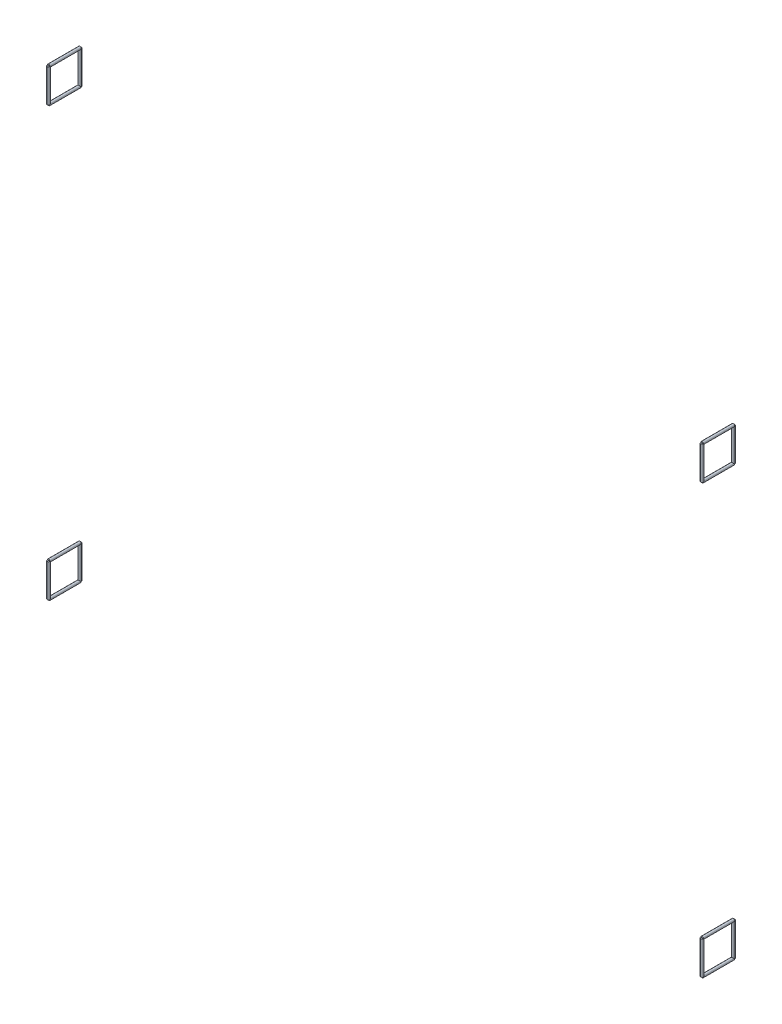
ISO-10303-21;
HEADER;
FILE_DESCRIPTION(('STEP AP214'),'2;1');
FILE_NAME('part.step','',(''),(''),'','','');
FILE_SCHEMA(('AUTOMOTIVE_DESIGN { 1 0 10303 214 1 1 1 1 }'));
ENDSEC;
DATA;
#1=APPLICATION_CONTEXT('core data for automotive mechanical design processes');
#2=APPLICATION_PROTOCOL_DEFINITION('international standard','automotive_design',2000,#1);
#3=PRODUCT_CONTEXT('',#1,'mechanical');
#4=PRODUCT('Part','Part','',(#3));
#5=PRODUCT_RELATED_PRODUCT_CATEGORY('part','',(#4));
#6=PRODUCT_DEFINITION_FORMATION('','',#4);
#7=PRODUCT_DEFINITION_CONTEXT('part definition',#1,'design');
#8=PRODUCT_DEFINITION('design','',#6,#7);
#9=PRODUCT_DEFINITION_SHAPE('','',#8);
#10=(LENGTH_UNIT() NAMED_UNIT(*) SI_UNIT(.MILLI.,.METRE.));
#11=(NAMED_UNIT(*) PLANE_ANGLE_UNIT() SI_UNIT($,.RADIAN.));
#12=(NAMED_UNIT(*) SI_UNIT($,.STERADIAN.) SOLID_ANGLE_UNIT());
#13=UNCERTAINTY_MEASURE_WITH_UNIT(LENGTH_MEASURE(1.E-05),#10,'distance_accuracy_value','');
#14=(GEOMETRIC_REPRESENTATION_CONTEXT(3) GLOBAL_UNCERTAINTY_ASSIGNED_CONTEXT((#13)) GLOBAL_UNIT_ASSIGNED_CONTEXT((#10,
#11,#12)) REPRESENTATION_CONTEXT('',''));
#15=CARTESIAN_POINT('',(0.,0.,0.));
#16=DIRECTION('',(0.,0.,1.));
#17=DIRECTION('',(1.,0.,0.));
#18=AXIS2_PLACEMENT_3D('',#15,#16,#17);
#19=CARTESIAN_POINT('',(-295.8,-179.,4.));
#20=DIRECTION('',(0.,1.,0.));
#21=DIRECTION('',(0.,0.,1.));
#22=AXIS2_PLACEMENT_3D('',#19,#20,#21);
#23=PLANE('',#22);
#24=DIRECTION('',(-1.,0.,0.));
#25=VECTOR('',#24,1.);
#26=CARTESIAN_POINT('',(-295.8,-179.,4.));
#27=LINE('',#26,#25);
#28=CARTESIAN_POINT('',(-294.55,-179.,4.));
#29=VERTEX_POINT('',#28);
#30=CARTESIAN_POINT('',(-297.05,-179.,4.));
#31=VERTEX_POINT('',#30);
#32=EDGE_CURVE('P0_E61',#29,#31,#27,.T.);
#33=ORIENTED_EDGE('',*,*,#32,.F.);
#34=CARTESIAN_POINT('',(-295.8,-179.,4.));
#35=DIRECTION('',(0.,-1.,0.));
#36=DIRECTION('',(0.,0.,-1.));
#37=AXIS2_PLACEMENT_3D('',#34,#35,#36);
#38=CIRCLE('',#37,1.25);
#39=EDGE_CURVE('P0_E110',#31,#29,#38,.T.);
#40=ORIENTED_EDGE('',*,*,#39,.F.);
#41=EDGE_LOOP('',(#33,#40));
#42=FACE_BOUND('',#41,.T.);
#43=ADVANCED_FACE('P0_F17',(#42),#23,.T.);
#44=CARTESIAN_POINT('',(-295.8,-209.,4.));
#45=DIRECTION('',(0.,-1.,0.));
#46=DIRECTION('',(0.,0.,-1.));
#47=AXIS2_PLACEMENT_3D('',#44,#45,#46);
#48=PLANE('',#47);
#49=DIRECTION('',(1.,0.,0.));
#50=VECTOR('',#49,1.);
#51=CARTESIAN_POINT('',(-295.8,-209.,4.));
#52=LINE('',#51,#50);
#53=CARTESIAN_POINT('',(-297.05,-209.,4.));
#54=VERTEX_POINT('',#53);
#55=CARTESIAN_POINT('',(-294.55,-209.,4.));
#56=VERTEX_POINT('',#55);
#57=EDGE_CURVE('P0_E104',#54,#56,#52,.T.);
#58=ORIENTED_EDGE('',*,*,#57,.F.);
#59=CARTESIAN_POINT('',(-295.8,-209.,4.));
#60=DIRECTION('',(0.,1.,0.));
#61=DIRECTION('',(0.,0.,1.));
#62=AXIS2_PLACEMENT_3D('',#59,#60,#61);
#63=CIRCLE('',#62,1.25);
#64=EDGE_CURVE('P0_E108',#56,#54,#63,.T.);
#65=ORIENTED_EDGE('',*,*,#64,.F.);
#66=EDGE_LOOP('',(#58,#65));
#67=FACE_BOUND('',#66,.T.);
#68=ADVANCED_FACE('P0_F128',(#67),#48,.T.);
#69=CARTESIAN_POINT('',(-295.8,-209.,4.));
#70=DIRECTION('',(0.,1.,0.));
#71=DIRECTION('',(0.,0.,1.));
#72=AXIS2_PLACEMENT_3D('',#69,#70,#71);
#73=CYLINDRICAL_SURFACE('',#72,1.25);
#74=CARTESIAN_POINT('',(-295.8,-179.,4.));
#75=DIRECTION('',(0.,0.707106781186547,0.707106781186547));
#76=DIRECTION('',(0.,0.707106781186547,-0.707106781186547));
#77=AXIS2_PLACEMENT_3D('',#74,#75,#76);
#78=ELLIPSE('',#77,1.76776695296637,1.25);
#79=EDGE_CURVE('P0_E26',#31,#29,#78,.T.);
#80=ORIENTED_EDGE('',*,*,#79,.F.);
#81=ORIENTED_EDGE('',*,*,#39,.T.);
#82=EDGE_LOOP('',(#80,#81));
#83=FACE_BOUND('',#82,.T.);
#84=CARTESIAN_POINT('',(-295.8,-209.,4.));
#85=DIRECTION('',(0.,0.707106781186547,-0.707106781186547));
#86=DIRECTION('',(0.,0.707106781186547,0.707106781186547));
#87=AXIS2_PLACEMENT_3D('',#84,#85,#86);
#88=ELLIPSE('',#87,1.76776695296637,1.25);
#89=EDGE_CURVE('P0_E113',#56,#54,#88,.F.);
#90=ORIENTED_EDGE('',*,*,#89,.F.);
#91=ORIENTED_EDGE('',*,*,#64,.T.);
#92=EDGE_LOOP('',(#90,#91));
#93=FACE_BOUND('',#92,.T.);
#94=ADVANCED_FACE('P0_F19',(#83,#93),#73,.T.);
#95=CARTESIAN_POINT('',(-295.8,-209.,32.25));
#96=DIRECTION('',(0.,0.,1.));
#97=DIRECTION('',(1.,0.,0.));
#98=AXIS2_PLACEMENT_3D('',#95,#96,#97);
#99=PLANE('',#98);
#100=DIRECTION('',(1.,0.,0.));
#101=VECTOR('',#100,1.);
#102=CARTESIAN_POINT('',(-295.8,-209.,32.25));
#103=LINE('',#102,#101);
#104=CARTESIAN_POINT('',(-297.05,-209.,32.25));
#105=VERTEX_POINT('',#104);
#106=CARTESIAN_POINT('',(-294.55,-209.,32.25));
#107=VERTEX_POINT('',#106);
#108=EDGE_CURVE('P0_E70',#105,#107,#103,.T.);
#109=ORIENTED_EDGE('',*,*,#108,.F.);
#110=CARTESIAN_POINT('',(-295.8,-209.,32.25));
#111=DIRECTION('',(0.,0.,-1.));
#112=DIRECTION('',(-1.,0.,0.));
#113=AXIS2_PLACEMENT_3D('',#110,#111,#112);
#114=CIRCLE('',#113,1.25);
#115=EDGE_CURVE('P0_E101',#107,#105,#114,.T.);
#116=ORIENTED_EDGE('',*,*,#115,.F.);
#117=EDGE_LOOP('',(#109,#116));
#118=FACE_BOUND('',#117,.T.);
#119=ADVANCED_FACE('P0_F127',(#118),#99,.T.);
#120=CARTESIAN_POINT('',(-295.8,-209.,4.));
#121=DIRECTION('',(0.,0.,-1.));
#122=DIRECTION('',(-1.,0.,0.));
#123=AXIS2_PLACEMENT_3D('',#120,#121,#122);
#124=PLANE('',#123);
#125=CARTESIAN_POINT('',(-295.8,-209.,4.));
#126=DIRECTION('',(0.,0.,1.));
#127=DIRECTION('',(1.,0.,0.));
#128=AXIS2_PLACEMENT_3D('',#125,#126,#127);
#129=CIRCLE('',#128,1.25);
#130=EDGE_CURVE('P0_E97',#54,#56,#129,.T.);
#131=ORIENTED_EDGE('',*,*,#130,.F.);
#132=ORIENTED_EDGE('',*,*,#57,.T.);
#133=EDGE_LOOP('',(#131,#132));
#134=FACE_BOUND('',#133,.T.);
#135=ADVANCED_FACE('P0_F135',(#134),#124,.T.);
#136=CARTESIAN_POINT('',(-295.8,-209.,4.));
#137=DIRECTION('',(0.,0.,1.));
#138=DIRECTION('',(1.,0.,0.));
#139=AXIS2_PLACEMENT_3D('',#136,#137,#138);
#140=CYLINDRICAL_SURFACE('',#139,1.25);
#141=CARTESIAN_POINT('',(-295.8,-209.,32.25));
#142=DIRECTION('',(0.,0.707106781186547,0.707106781186547));
#143=DIRECTION('',(0.,-0.707106781186547,0.707106781186547));
#144=AXIS2_PLACEMENT_3D('',#141,#142,#143);
#145=ELLIPSE('',#144,1.76776695296637,1.25);
#146=EDGE_CURVE('P0_E32',#107,#105,#145,.T.);
#147=ORIENTED_EDGE('',*,*,#146,.F.);
#148=ORIENTED_EDGE('',*,*,#115,.T.);
#149=EDGE_LOOP('',(#147,#148));
#150=FACE_BOUND('',#149,.T.);
#151=ORIENTED_EDGE('',*,*,#130,.T.);
#152=ORIENTED_EDGE('',*,*,#89,.T.);
#153=EDGE_LOOP('',(#151,#152));
#154=FACE_BOUND('',#153,.T.);
#155=ADVANCED_FACE('P0_F136',(#150,#154),#140,.T.);
#156=CARTESIAN_POINT('',(-295.8,-179.,32.25));
#157=DIRECTION('',(0.,0.,1.));
#158=DIRECTION('',(1.,0.,0.));
#159=AXIS2_PLACEMENT_3D('',#156,#157,#158);
#160=PLANE('',#159);
#161=DIRECTION('',(-1.,0.,0.));
#162=VECTOR('',#161,1.);
#163=CARTESIAN_POINT('',(-295.8,-179.,32.25));
#164=LINE('',#163,#162);
#165=CARTESIAN_POINT('',(-294.55,-179.,32.25));
#166=VERTEX_POINT('',#165);
#167=CARTESIAN_POINT('',(-297.05,-179.,32.25));
#168=VERTEX_POINT('',#167);
#169=EDGE_CURVE('P0_E64',#166,#168,#164,.T.);
#170=ORIENTED_EDGE('',*,*,#169,.F.);
#171=CARTESIAN_POINT('',(-295.8,-179.,32.25));
#172=DIRECTION('',(0.,0.,-1.));
#173=DIRECTION('',(-1.,0.,0.));
#174=AXIS2_PLACEMENT_3D('',#171,#172,#173);
#175=CIRCLE('',#174,1.25);
#176=EDGE_CURVE('P0_E54',#168,#166,#175,.T.);
#177=ORIENTED_EDGE('',*,*,#176,.F.);
#178=EDGE_LOOP('',(#170,#177));
#179=FACE_BOUND('',#178,.T.);
#180=ADVANCED_FACE('P0_F65',(#179),#160,.T.);
#181=CARTESIAN_POINT('',(-295.8,-179.,4.));
#182=DIRECTION('',(0.,0.,-1.));
#183=DIRECTION('',(-1.,0.,0.));
#184=AXIS2_PLACEMENT_3D('',#181,#182,#183);
#185=PLANE('',#184);
#186=CARTESIAN_POINT('',(-295.8,-179.,4.));
#187=DIRECTION('',(0.,0.,1.));
#188=DIRECTION('',(1.,0.,0.));
#189=AXIS2_PLACEMENT_3D('',#186,#187,#188);
#190=CIRCLE('',#189,1.25);
#191=EDGE_CURVE('P0_E62',#29,#31,#190,.T.);
#192=ORIENTED_EDGE('',*,*,#191,.F.);
#193=ORIENTED_EDGE('',*,*,#32,.T.);
#194=EDGE_LOOP('',(#192,#193));
#195=FACE_BOUND('',#194,.T.);
#196=ADVANCED_FACE('P0_F122',(#195),#185,.T.);
#197=CARTESIAN_POINT('',(-295.8,-179.,4.));
#198=DIRECTION('',(0.,0.,1.));
#199=DIRECTION('',(1.,0.,0.));
#200=AXIS2_PLACEMENT_3D('',#197,#198,#199);
#201=CYLINDRICAL_SURFACE('',#200,1.25);
#202=CARTESIAN_POINT('',(-295.8,-179.,32.25));
#203=DIRECTION('',(0.,-0.707106781186547,0.707106781186547));
#204=DIRECTION('',(0.,0.707106781186547,0.707106781186547));
#205=AXIS2_PLACEMENT_3D('',#202,#203,#204);
#206=ELLIPSE('',#205,1.76776695296637,1.25);
#207=EDGE_CURVE('P0_E11',#168,#166,#206,.T.);
#208=ORIENTED_EDGE('',*,*,#207,.F.);
#209=ORIENTED_EDGE('',*,*,#176,.T.);
#210=EDGE_LOOP('',(#208,#209));
#211=FACE_BOUND('',#210,.T.);
#212=ORIENTED_EDGE('',*,*,#191,.T.);
#213=ORIENTED_EDGE('',*,*,#79,.T.);
#214=EDGE_LOOP('',(#212,#213));
#215=FACE_BOUND('',#214,.T.);
#216=ADVANCED_FACE('P0_F56',(#211,#215),#201,.T.);
#217=CARTESIAN_POINT('',(-295.8,-179.,32.25));
#218=DIRECTION('',(0.,1.,0.));
#219=DIRECTION('',(0.,0.,1.));
#220=AXIS2_PLACEMENT_3D('',#217,#218,#219);
#221=PLANE('',#220);
#222=CARTESIAN_POINT('',(-295.8,-179.,32.25));
#223=DIRECTION('',(0.,-1.,0.));
#224=DIRECTION('',(0.,0.,-1.));
#225=AXIS2_PLACEMENT_3D('',#222,#223,#224);
#226=CIRCLE('',#225,1.25);
#227=EDGE_CURVE('P0_E75',#166,#168,#226,.T.);
#228=ORIENTED_EDGE('',*,*,#227,.F.);
#229=ORIENTED_EDGE('',*,*,#169,.T.);
#230=EDGE_LOOP('',(#228,#229));
#231=FACE_BOUND('',#230,.T.);
#232=ADVANCED_FACE('P0_F76',(#231),#221,.T.);
#233=CARTESIAN_POINT('',(-295.8,-209.,32.25));
#234=DIRECTION('',(0.,-1.,0.));
#235=DIRECTION('',(0.,0.,-1.));
#236=AXIS2_PLACEMENT_3D('',#233,#234,#235);
#237=PLANE('',#236);
#238=CARTESIAN_POINT('',(-295.8,-209.,32.25));
#239=DIRECTION('',(0.,1.,0.));
#240=DIRECTION('',(0.,0.,1.));
#241=AXIS2_PLACEMENT_3D('',#238,#239,#240);
#242=CIRCLE('',#241,1.25);
#243=EDGE_CURVE('P0_E78',#105,#107,#242,.T.);
#244=ORIENTED_EDGE('',*,*,#243,.F.);
#245=ORIENTED_EDGE('',*,*,#108,.T.);
#246=EDGE_LOOP('',(#244,#245));
#247=FACE_BOUND('',#246,.T.);
#248=ADVANCED_FACE('P0_F205',(#247),#237,.T.);
#249=CARTESIAN_POINT('',(-295.8,-209.,32.25));
#250=DIRECTION('',(0.,1.,0.));
#251=DIRECTION('',(0.,0.,1.));
#252=AXIS2_PLACEMENT_3D('',#249,#250,#251);
#253=CYLINDRICAL_SURFACE('',#252,1.25);
#254=ORIENTED_EDGE('',*,*,#227,.T.);
#255=ORIENTED_EDGE('',*,*,#207,.T.);
#256=EDGE_LOOP('',(#254,#255));
#257=FACE_BOUND('',#256,.T.);
#258=ORIENTED_EDGE('',*,*,#243,.T.);
#259=ORIENTED_EDGE('',*,*,#146,.T.);
#260=EDGE_LOOP('',(#258,#259));
#261=FACE_BOUND('',#260,.T.);
#262=ADVANCED_FACE('P0_F73',(#257,#261),#253,.T.);
#263=CLOSED_SHELL('',(#43,#68,#94,#119,#135,#155,#180,#196,#216,#232,#248,#262));
#264=MANIFOLD_SOLID_BREP('P0_B1',#263);
#265=CARTESIAN_POINT('',(-295.8,209.,4.));
#266=DIRECTION('',(0.,1.,0.));
#267=DIRECTION('',(0.,0.,1.));
#268=AXIS2_PLACEMENT_3D('',#265,#266,#267);
#269=PLANE('',#268);
#270=DIRECTION('',(-1.,0.,0.));
#271=VECTOR('',#270,1.);
#272=CARTESIAN_POINT('',(-295.8,209.,4.));
#273=LINE('',#272,#271);
#274=CARTESIAN_POINT('',(-294.55,209.,4.));
#275=VERTEX_POINT('',#274);
#276=CARTESIAN_POINT('',(-297.05,209.,4.));
#277=VERTEX_POINT('',#276);
#278=EDGE_CURVE('P1_E61',#275,#277,#273,.T.);
#279=ORIENTED_EDGE('',*,*,#278,.F.);
#280=CARTESIAN_POINT('',(-295.8,209.,4.));
#281=DIRECTION('',(0.,-1.,0.));
#282=DIRECTION('',(0.,0.,-1.));
#283=AXIS2_PLACEMENT_3D('',#280,#281,#282);
#284=CIRCLE('',#283,1.25);
#285=EDGE_CURVE('P1_E112',#277,#275,#284,.T.);
#286=ORIENTED_EDGE('',*,*,#285,.F.);
#287=EDGE_LOOP('',(#279,#286));
#288=FACE_BOUND('',#287,.T.);
#289=ADVANCED_FACE('P1_F17',(#288),#269,.T.);
#290=CARTESIAN_POINT('',(-295.8,179.,4.));
#291=DIRECTION('',(0.,-1.,0.));
#292=DIRECTION('',(0.,0.,-1.));
#293=AXIS2_PLACEMENT_3D('',#290,#291,#292);
#294=PLANE('',#293);
#295=DIRECTION('',(1.,0.,0.));
#296=VECTOR('',#295,1.);
#297=CARTESIAN_POINT('',(-295.8,179.,4.));
#298=LINE('',#297,#296);
#299=CARTESIAN_POINT('',(-297.05,179.,4.));
#300=VERTEX_POINT('',#299);
#301=CARTESIAN_POINT('',(-294.55,179.,4.));
#302=VERTEX_POINT('',#301);
#303=EDGE_CURVE('P1_E105',#300,#302,#298,.T.);
#304=ORIENTED_EDGE('',*,*,#303,.F.);
#305=CARTESIAN_POINT('',(-295.8,179.,4.));
#306=DIRECTION('',(0.,1.,0.));
#307=DIRECTION('',(0.,0.,1.));
#308=AXIS2_PLACEMENT_3D('',#305,#306,#307);
#309=CIRCLE('',#308,1.25);
#310=EDGE_CURVE('P1_E109',#302,#300,#309,.T.);
#311=ORIENTED_EDGE('',*,*,#310,.F.);
#312=EDGE_LOOP('',(#304,#311));
#313=FACE_BOUND('',#312,.T.);
#314=ADVANCED_FACE('P1_F128',(#313),#294,.T.);
#315=CARTESIAN_POINT('',(-295.8,179.,4.));
#316=DIRECTION('',(0.,1.,0.));
#317=DIRECTION('',(0.,0.,1.));
#318=AXIS2_PLACEMENT_3D('',#315,#316,#317);
#319=CYLINDRICAL_SURFACE('',#318,1.25);
#320=CARTESIAN_POINT('',(-295.8,209.,4.));
#321=DIRECTION('',(0.,0.707106781186547,0.707106781186547));
#322=DIRECTION('',(0.,0.707106781186547,-0.707106781186547));
#323=AXIS2_PLACEMENT_3D('',#320,#321,#322);
#324=ELLIPSE('',#323,1.76776695296637,1.25);
#325=EDGE_CURVE('P1_E26',#277,#275,#324,.T.);
#326=ORIENTED_EDGE('',*,*,#325,.F.);
#327=ORIENTED_EDGE('',*,*,#285,.T.);
#328=EDGE_LOOP('',(#326,#327));
#329=FACE_BOUND('',#328,.T.);
#330=CARTESIAN_POINT('',(-295.8,179.,4.));
#331=DIRECTION('',(0.,0.707106781186547,-0.707106781186547));
#332=DIRECTION('',(0.,0.707106781186547,0.707106781186547));
#333=AXIS2_PLACEMENT_3D('',#330,#331,#332);
#334=ELLIPSE('',#333,1.76776695296637,1.25);
#335=EDGE_CURVE('P1_E114',#302,#300,#334,.F.);
#336=ORIENTED_EDGE('',*,*,#335,.F.);
#337=ORIENTED_EDGE('',*,*,#310,.T.);
#338=EDGE_LOOP('',(#336,#337));
#339=FACE_BOUND('',#338,.T.);
#340=ADVANCED_FACE('P1_F19',(#329,#339),#319,.T.);
#341=CARTESIAN_POINT('',(-295.8,179.,32.25));
#342=DIRECTION('',(0.,0.,1.));
#343=DIRECTION('',(1.,0.,0.));
#344=AXIS2_PLACEMENT_3D('',#341,#342,#343);
#345=PLANE('',#344);
#346=DIRECTION('',(1.,0.,0.));
#347=VECTOR('',#346,1.);
#348=CARTESIAN_POINT('',(-295.8,179.,32.25));
#349=LINE('',#348,#347);
#350=CARTESIAN_POINT('',(-297.05,179.,32.25));
#351=VERTEX_POINT('',#350);
#352=CARTESIAN_POINT('',(-294.55,179.,32.25));
#353=VERTEX_POINT('',#352);
#354=EDGE_CURVE('P1_E70',#351,#353,#349,.T.);
#355=ORIENTED_EDGE('',*,*,#354,.F.);
#356=CARTESIAN_POINT('',(-295.8,179.,32.25));
#357=DIRECTION('',(0.,0.,-1.));
#358=DIRECTION('',(-1.,0.,0.));
#359=AXIS2_PLACEMENT_3D('',#356,#357,#358);
#360=CIRCLE('',#359,1.25);
#361=EDGE_CURVE('P1_E102',#353,#351,#360,.T.);
#362=ORIENTED_EDGE('',*,*,#361,.F.);
#363=EDGE_LOOP('',(#355,#362));
#364=FACE_BOUND('',#363,.T.);
#365=ADVANCED_FACE('P1_F127',(#364),#345,.T.);
#366=CARTESIAN_POINT('',(-295.8,179.,4.));
#367=DIRECTION('',(0.,0.,-1.));
#368=DIRECTION('',(-1.,0.,0.));
#369=AXIS2_PLACEMENT_3D('',#366,#367,#368);
#370=PLANE('',#369);
#371=CARTESIAN_POINT('',(-295.8,179.,4.));
#372=DIRECTION('',(0.,0.,1.));
#373=DIRECTION('',(1.,0.,0.));
#374=AXIS2_PLACEMENT_3D('',#371,#372,#373);
#375=CIRCLE('',#374,1.25);
#376=EDGE_CURVE('P1_E98',#300,#302,#375,.T.);
#377=ORIENTED_EDGE('',*,*,#376,.F.);
#378=ORIENTED_EDGE('',*,*,#303,.T.);
#379=EDGE_LOOP('',(#377,#378));
#380=FACE_BOUND('',#379,.T.);
#381=ADVANCED_FACE('P1_F135',(#380),#370,.T.);
#382=CARTESIAN_POINT('',(-295.8,179.,4.));
#383=DIRECTION('',(0.,0.,1.));
#384=DIRECTION('',(1.,0.,0.));
#385=AXIS2_PLACEMENT_3D('',#382,#383,#384);
#386=CYLINDRICAL_SURFACE('',#385,1.25);
#387=CARTESIAN_POINT('',(-295.8,179.,32.25));
#388=DIRECTION('',(0.,0.707106781186547,0.707106781186547));
#389=DIRECTION('',(0.,-0.707106781186547,0.707106781186547));
#390=AXIS2_PLACEMENT_3D('',#387,#388,#389);
#391=ELLIPSE('',#390,1.76776695296637,1.25);
#392=EDGE_CURVE('P1_E32',#353,#351,#391,.T.);
#393=ORIENTED_EDGE('',*,*,#392,.F.);
#394=ORIENTED_EDGE('',*,*,#361,.T.);
#395=EDGE_LOOP('',(#393,#394));
#396=FACE_BOUND('',#395,.T.);
#397=ORIENTED_EDGE('',*,*,#376,.T.);
#398=ORIENTED_EDGE('',*,*,#335,.T.);
#399=EDGE_LOOP('',(#397,#398));
#400=FACE_BOUND('',#399,.T.);
#401=ADVANCED_FACE('P1_F136',(#396,#400),#386,.T.);
#402=CARTESIAN_POINT('',(-295.8,209.,32.25));
#403=DIRECTION('',(0.,0.,1.));
#404=DIRECTION('',(1.,0.,0.));
#405=AXIS2_PLACEMENT_3D('',#402,#403,#404);
#406=PLANE('',#405);
#407=DIRECTION('',(-1.,0.,0.));
#408=VECTOR('',#407,1.);
#409=CARTESIAN_POINT('',(-295.8,209.,32.25));
#410=LINE('',#409,#408);
#411=CARTESIAN_POINT('',(-294.55,209.,32.25));
#412=VERTEX_POINT('',#411);
#413=CARTESIAN_POINT('',(-297.05,209.,32.25));
#414=VERTEX_POINT('',#413);
#415=EDGE_CURVE('P1_E64',#412,#414,#410,.T.);
#416=ORIENTED_EDGE('',*,*,#415,.F.);
#417=CARTESIAN_POINT('',(-295.8,209.,32.25));
#418=DIRECTION('',(0.,0.,-1.));
#419=DIRECTION('',(-1.,0.,0.));
#420=AXIS2_PLACEMENT_3D('',#417,#418,#419);
#421=CIRCLE('',#420,1.25);
#422=EDGE_CURVE('P1_E54',#414,#412,#421,.T.);
#423=ORIENTED_EDGE('',*,*,#422,.F.);
#424=EDGE_LOOP('',(#416,#423));
#425=FACE_BOUND('',#424,.T.);
#426=ADVANCED_FACE('P1_F65',(#425),#406,.T.);
#427=CARTESIAN_POINT('',(-295.8,209.,4.));
#428=DIRECTION('',(0.,0.,-1.));
#429=DIRECTION('',(-1.,0.,0.));
#430=AXIS2_PLACEMENT_3D('',#427,#428,#429);
#431=PLANE('',#430);
#432=CARTESIAN_POINT('',(-295.8,209.,4.));
#433=DIRECTION('',(0.,0.,1.));
#434=DIRECTION('',(1.,0.,0.));
#435=AXIS2_PLACEMENT_3D('',#432,#433,#434);
#436=CIRCLE('',#435,1.25);
#437=EDGE_CURVE('P1_E62',#275,#277,#436,.T.);
#438=ORIENTED_EDGE('',*,*,#437,.F.);
#439=ORIENTED_EDGE('',*,*,#278,.T.);
#440=EDGE_LOOP('',(#438,#439));
#441=FACE_BOUND('',#440,.T.);
#442=ADVANCED_FACE('P1_F122',(#441),#431,.T.);
#443=CARTESIAN_POINT('',(-295.8,209.,4.));
#444=DIRECTION('',(0.,0.,1.));
#445=DIRECTION('',(1.,0.,0.));
#446=AXIS2_PLACEMENT_3D('',#443,#444,#445);
#447=CYLINDRICAL_SURFACE('',#446,1.25);
#448=CARTESIAN_POINT('',(-295.8,209.,32.25));
#449=DIRECTION('',(0.,-0.707106781186547,0.707106781186547));
#450=DIRECTION('',(0.,0.707106781186547,0.707106781186547));
#451=AXIS2_PLACEMENT_3D('',#448,#449,#450);
#452=ELLIPSE('',#451,1.76776695296637,1.25);
#453=EDGE_CURVE('P1_E11',#414,#412,#452,.T.);
#454=ORIENTED_EDGE('',*,*,#453,.F.);
#455=ORIENTED_EDGE('',*,*,#422,.T.);
#456=EDGE_LOOP('',(#454,#455));
#457=FACE_BOUND('',#456,.T.);
#458=ORIENTED_EDGE('',*,*,#437,.T.);
#459=ORIENTED_EDGE('',*,*,#325,.T.);
#460=EDGE_LOOP('',(#458,#459));
#461=FACE_BOUND('',#460,.T.);
#462=ADVANCED_FACE('P1_F56',(#457,#461),#447,.T.);
#463=CARTESIAN_POINT('',(-295.8,209.,32.25));
#464=DIRECTION('',(0.,1.,0.));
#465=DIRECTION('',(0.,0.,1.));
#466=AXIS2_PLACEMENT_3D('',#463,#464,#465);
#467=PLANE('',#466);
#468=CARTESIAN_POINT('',(-295.8,209.,32.25));
#469=DIRECTION('',(0.,-1.,0.));
#470=DIRECTION('',(0.,0.,-1.));
#471=AXIS2_PLACEMENT_3D('',#468,#469,#470);
#472=CIRCLE('',#471,1.25);
#473=EDGE_CURVE('P1_E75',#412,#414,#472,.T.);
#474=ORIENTED_EDGE('',*,*,#473,.F.);
#475=ORIENTED_EDGE('',*,*,#415,.T.);
#476=EDGE_LOOP('',(#474,#475));
#477=FACE_BOUND('',#476,.T.);
#478=ADVANCED_FACE('P1_F76',(#477),#467,.T.);
#479=CARTESIAN_POINT('',(-295.8,179.,32.25));
#480=DIRECTION('',(0.,-1.,0.));
#481=DIRECTION('',(0.,0.,-1.));
#482=AXIS2_PLACEMENT_3D('',#479,#480,#481);
#483=PLANE('',#482);
#484=CARTESIAN_POINT('',(-295.8,179.,32.25));
#485=DIRECTION('',(0.,1.,0.));
#486=DIRECTION('',(0.,0.,1.));
#487=AXIS2_PLACEMENT_3D('',#484,#485,#486);
#488=CIRCLE('',#487,1.25);
#489=EDGE_CURVE('P1_E78',#351,#353,#488,.T.);
#490=ORIENTED_EDGE('',*,*,#489,.F.);
#491=ORIENTED_EDGE('',*,*,#354,.T.);
#492=EDGE_LOOP('',(#490,#491));
#493=FACE_BOUND('',#492,.T.);
#494=ADVANCED_FACE('P1_F205',(#493),#483,.T.);
#495=CARTESIAN_POINT('',(-295.8,179.,32.25));
#496=DIRECTION('',(0.,1.,0.));
#497=DIRECTION('',(0.,0.,1.));
#498=AXIS2_PLACEMENT_3D('',#495,#496,#497);
#499=CYLINDRICAL_SURFACE('',#498,1.25);
#500=ORIENTED_EDGE('',*,*,#473,.T.);
#501=ORIENTED_EDGE('',*,*,#453,.T.);
#502=EDGE_LOOP('',(#500,#501));
#503=FACE_BOUND('',#502,.T.);
#504=ORIENTED_EDGE('',*,*,#489,.T.);
#505=ORIENTED_EDGE('',*,*,#392,.T.);
#506=EDGE_LOOP('',(#504,#505));
#507=FACE_BOUND('',#506,.T.);
#508=ADVANCED_FACE('P1_F73',(#503,#507),#499,.T.);
#509=CLOSED_SHELL('',(#289,#314,#340,#365,#381,#401,#426,#442,#462,#478,#494,#508));
#510=MANIFOLD_SOLID_BREP('P1_B1',#509);
#511=CARTESIAN_POINT('',(295.8,-179.,4.));
#512=DIRECTION('',(0.,1.,0.));
#513=DIRECTION('',(0.,0.,1.));
#514=AXIS2_PLACEMENT_3D('',#511,#512,#513);
#515=PLANE('',#514);
#516=DIRECTION('',(-1.,0.,0.));
#517=VECTOR('',#516,1.);
#518=CARTESIAN_POINT('',(295.8,-179.,4.));
#519=LINE('',#518,#517);
#520=CARTESIAN_POINT('',(297.05,-179.,4.));
#521=VERTEX_POINT('',#520);
#522=CARTESIAN_POINT('',(294.55,-179.,4.));
#523=VERTEX_POINT('',#522);
#524=EDGE_CURVE('P2_E61',#521,#523,#519,.T.);
#525=ORIENTED_EDGE('',*,*,#524,.F.);
#526=CARTESIAN_POINT('',(295.8,-179.,4.));
#527=DIRECTION('',(0.,-1.,0.));
#528=DIRECTION('',(0.,0.,-1.));
#529=AXIS2_PLACEMENT_3D('',#526,#527,#528);
#530=CIRCLE('',#529,1.25);
#531=EDGE_CURVE('P2_E110',#523,#521,#530,.T.);
#532=ORIENTED_EDGE('',*,*,#531,.F.);
#533=EDGE_LOOP('',(#525,#532));
#534=FACE_BOUND('',#533,.T.);
#535=ADVANCED_FACE('P2_F17',(#534),#515,.T.);
#536=CARTESIAN_POINT('',(295.8,-209.,4.));
#537=DIRECTION('',(0.,-1.,0.));
#538=DIRECTION('',(0.,0.,-1.));
#539=AXIS2_PLACEMENT_3D('',#536,#537,#538);
#540=PLANE('',#539);
#541=DIRECTION('',(1.,0.,0.));
#542=VECTOR('',#541,1.);
#543=CARTESIAN_POINT('',(295.8,-209.,4.));
#544=LINE('',#543,#542);
#545=CARTESIAN_POINT('',(294.55,-209.,4.));
#546=VERTEX_POINT('',#545);
#547=CARTESIAN_POINT('',(297.05,-209.,4.));
#548=VERTEX_POINT('',#547);
#549=EDGE_CURVE('P2_E103',#546,#548,#544,.T.);
#550=ORIENTED_EDGE('',*,*,#549,.F.);
#551=CARTESIAN_POINT('',(295.8,-209.,4.));
#552=DIRECTION('',(0.,1.,0.));
#553=DIRECTION('',(0.,0.,1.));
#554=AXIS2_PLACEMENT_3D('',#551,#552,#553);
#555=CIRCLE('',#554,1.25);
#556=EDGE_CURVE('P2_E107',#548,#546,#555,.T.);
#557=ORIENTED_EDGE('',*,*,#556,.F.);
#558=EDGE_LOOP('',(#550,#557));
#559=FACE_BOUND('',#558,.T.);
#560=ADVANCED_FACE('P2_F128',(#559),#540,.T.);
#561=CARTESIAN_POINT('',(295.8,-209.,4.));
#562=DIRECTION('',(0.,1.,0.));
#563=DIRECTION('',(0.,0.,1.));
#564=AXIS2_PLACEMENT_3D('',#561,#562,#563);
#565=CYLINDRICAL_SURFACE('',#564,1.25);
#566=CARTESIAN_POINT('',(295.8,-179.,4.));
#567=DIRECTION('',(0.,0.707106781186547,0.707106781186547));
#568=DIRECTION('',(0.,0.707106781186547,-0.707106781186547));
#569=AXIS2_PLACEMENT_3D('',#566,#567,#568);
#570=ELLIPSE('',#569,1.76776695296637,1.25);
#571=EDGE_CURVE('P2_E26',#523,#521,#570,.T.);
#572=ORIENTED_EDGE('',*,*,#571,.F.);
#573=ORIENTED_EDGE('',*,*,#531,.T.);
#574=EDGE_LOOP('',(#572,#573));
#575=FACE_BOUND('',#574,.T.);
#576=CARTESIAN_POINT('',(295.8,-209.,4.));
#577=DIRECTION('',(0.,0.707106781186547,-0.707106781186547));
#578=DIRECTION('',(0.,0.707106781186547,0.707106781186547));
#579=AXIS2_PLACEMENT_3D('',#576,#577,#578);
#580=ELLIPSE('',#579,1.76776695296637,1.25);
#581=EDGE_CURVE('P2_E113',#548,#546,#580,.F.);
#582=ORIENTED_EDGE('',*,*,#581,.F.);
#583=ORIENTED_EDGE('',*,*,#556,.T.);
#584=EDGE_LOOP('',(#582,#583));
#585=FACE_BOUND('',#584,.T.);
#586=ADVANCED_FACE('P2_F19',(#575,#585),#565,.T.);
#587=CARTESIAN_POINT('',(295.8,-209.,32.25));
#588=DIRECTION('',(0.,0.,1.));
#589=DIRECTION('',(1.,0.,0.));
#590=AXIS2_PLACEMENT_3D('',#587,#588,#589);
#591=PLANE('',#590);
#592=DIRECTION('',(1.,0.,0.));
#593=VECTOR('',#592,1.);
#594=CARTESIAN_POINT('',(295.8,-209.,32.25));
#595=LINE('',#594,#593);
#596=CARTESIAN_POINT('',(294.55,-209.,32.25));
#597=VERTEX_POINT('',#596);
#598=CARTESIAN_POINT('',(297.05,-209.,32.25));
#599=VERTEX_POINT('',#598);
#600=EDGE_CURVE('P2_E70',#597,#599,#595,.T.);
#601=ORIENTED_EDGE('',*,*,#600,.F.);
#602=CARTESIAN_POINT('',(295.8,-209.,32.25));
#603=DIRECTION('',(0.,0.,-1.));
#604=DIRECTION('',(-1.,0.,0.));
#605=AXIS2_PLACEMENT_3D('',#602,#603,#604);
#606=CIRCLE('',#605,1.25);
#607=EDGE_CURVE('P2_E100',#599,#597,#606,.T.);
#608=ORIENTED_EDGE('',*,*,#607,.F.);
#609=EDGE_LOOP('',(#601,#608));
#610=FACE_BOUND('',#609,.T.);
#611=ADVANCED_FACE('P2_F127',(#610),#591,.T.);
#612=CARTESIAN_POINT('',(295.8,-209.,4.));
#613=DIRECTION('',(0.,0.,-1.));
#614=DIRECTION('',(-1.,0.,0.));
#615=AXIS2_PLACEMENT_3D('',#612,#613,#614);
#616=PLANE('',#615);
#617=CARTESIAN_POINT('',(295.8,-209.,4.));
#618=DIRECTION('',(0.,0.,1.));
#619=DIRECTION('',(1.,0.,0.));
#620=AXIS2_PLACEMENT_3D('',#617,#618,#619);
#621=CIRCLE('',#620,1.25);
#622=EDGE_CURVE('P2_E96',#546,#548,#621,.T.);
#623=ORIENTED_EDGE('',*,*,#622,.F.);
#624=ORIENTED_EDGE('',*,*,#549,.T.);
#625=EDGE_LOOP('',(#623,#624));
#626=FACE_BOUND('',#625,.T.);
#627=ADVANCED_FACE('P2_F135',(#626),#616,.T.);
#628=CARTESIAN_POINT('',(295.8,-209.,4.));
#629=DIRECTION('',(0.,0.,1.));
#630=DIRECTION('',(1.,0.,0.));
#631=AXIS2_PLACEMENT_3D('',#628,#629,#630);
#632=CYLINDRICAL_SURFACE('',#631,1.25);
#633=CARTESIAN_POINT('',(295.8,-209.,32.25));
#634=DIRECTION('',(0.,0.707106781186547,0.707106781186547));
#635=DIRECTION('',(0.,-0.707106781186547,0.707106781186547));
#636=AXIS2_PLACEMENT_3D('',#633,#634,#635);
#637=ELLIPSE('',#636,1.76776695296637,1.25);
#638=EDGE_CURVE('P2_E32',#599,#597,#637,.T.);
#639=ORIENTED_EDGE('',*,*,#638,.F.);
#640=ORIENTED_EDGE('',*,*,#607,.T.);
#641=EDGE_LOOP('',(#639,#640));
#642=FACE_BOUND('',#641,.T.);
#643=ORIENTED_EDGE('',*,*,#622,.T.);
#644=ORIENTED_EDGE('',*,*,#581,.T.);
#645=EDGE_LOOP('',(#643,#644));
#646=FACE_BOUND('',#645,.T.);
#647=ADVANCED_FACE('P2_F136',(#642,#646),#632,.T.);
#648=CARTESIAN_POINT('',(295.8,-179.,32.25));
#649=DIRECTION('',(0.,0.,1.));
#650=DIRECTION('',(1.,0.,0.));
#651=AXIS2_PLACEMENT_3D('',#648,#649,#650);
#652=PLANE('',#651);
#653=DIRECTION('',(-1.,0.,0.));
#654=VECTOR('',#653,1.);
#655=CARTESIAN_POINT('',(295.8,-179.,32.25));
#656=LINE('',#655,#654);
#657=CARTESIAN_POINT('',(297.05,-179.,32.25));
#658=VERTEX_POINT('',#657);
#659=CARTESIAN_POINT('',(294.55,-179.,32.25));
#660=VERTEX_POINT('',#659);
#661=EDGE_CURVE('P2_E64',#658,#660,#656,.T.);
#662=ORIENTED_EDGE('',*,*,#661,.F.);
#663=CARTESIAN_POINT('',(295.8,-179.,32.25));
#664=DIRECTION('',(0.,0.,-1.));
#665=DIRECTION('',(-1.,0.,0.));
#666=AXIS2_PLACEMENT_3D('',#663,#664,#665);
#667=CIRCLE('',#666,1.25);
#668=EDGE_CURVE('P2_E54',#660,#658,#667,.T.);
#669=ORIENTED_EDGE('',*,*,#668,.F.);
#670=EDGE_LOOP('',(#662,#669));
#671=FACE_BOUND('',#670,.T.);
#672=ADVANCED_FACE('P2_F65',(#671),#652,.T.);
#673=CARTESIAN_POINT('',(295.8,-179.,4.));
#674=DIRECTION('',(0.,0.,-1.));
#675=DIRECTION('',(-1.,0.,0.));
#676=AXIS2_PLACEMENT_3D('',#673,#674,#675);
#677=PLANE('',#676);
#678=CARTESIAN_POINT('',(295.8,-179.,4.));
#679=DIRECTION('',(0.,0.,1.));
#680=DIRECTION('',(1.,0.,0.));
#681=AXIS2_PLACEMENT_3D('',#678,#679,#680);
#682=CIRCLE('',#681,1.25);
#683=EDGE_CURVE('P2_E62',#521,#523,#682,.T.);
#684=ORIENTED_EDGE('',*,*,#683,.F.);
#685=ORIENTED_EDGE('',*,*,#524,.T.);
#686=EDGE_LOOP('',(#684,#685));
#687=FACE_BOUND('',#686,.T.);
#688=ADVANCED_FACE('P2_F122',(#687),#677,.T.);
#689=CARTESIAN_POINT('',(295.8,-179.,4.));
#690=DIRECTION('',(0.,0.,1.));
#691=DIRECTION('',(1.,0.,0.));
#692=AXIS2_PLACEMENT_3D('',#689,#690,#691);
#693=CYLINDRICAL_SURFACE('',#692,1.25);
#694=CARTESIAN_POINT('',(295.8,-179.,32.25));
#695=DIRECTION('',(0.,-0.707106781186547,0.707106781186547));
#696=DIRECTION('',(0.,0.707106781186547,0.707106781186547));
#697=AXIS2_PLACEMENT_3D('',#694,#695,#696);
#698=ELLIPSE('',#697,1.76776695296637,1.25);
#699=EDGE_CURVE('P2_E11',#660,#658,#698,.T.);
#700=ORIENTED_EDGE('',*,*,#699,.F.);
#701=ORIENTED_EDGE('',*,*,#668,.T.);
#702=EDGE_LOOP('',(#700,#701));
#703=FACE_BOUND('',#702,.T.);
#704=ORIENTED_EDGE('',*,*,#683,.T.);
#705=ORIENTED_EDGE('',*,*,#571,.T.);
#706=EDGE_LOOP('',(#704,#705));
#707=FACE_BOUND('',#706,.T.);
#708=ADVANCED_FACE('P2_F56',(#703,#707),#693,.T.);
#709=CARTESIAN_POINT('',(295.8,-179.,32.25));
#710=DIRECTION('',(0.,1.,0.));
#711=DIRECTION('',(0.,0.,1.));
#712=AXIS2_PLACEMENT_3D('',#709,#710,#711);
#713=PLANE('',#712);
#714=CARTESIAN_POINT('',(295.8,-179.,32.25));
#715=DIRECTION('',(0.,-1.,0.));
#716=DIRECTION('',(0.,0.,-1.));
#717=AXIS2_PLACEMENT_3D('',#714,#715,#716);
#718=CIRCLE('',#717,1.25);
#719=EDGE_CURVE('P2_E75',#658,#660,#718,.T.);
#720=ORIENTED_EDGE('',*,*,#719,.F.);
#721=ORIENTED_EDGE('',*,*,#661,.T.);
#722=EDGE_LOOP('',(#720,#721));
#723=FACE_BOUND('',#722,.T.);
#724=ADVANCED_FACE('P2_F76',(#723),#713,.T.);
#725=CARTESIAN_POINT('',(295.8,-209.,32.25));
#726=DIRECTION('',(0.,-1.,0.));
#727=DIRECTION('',(0.,0.,-1.));
#728=AXIS2_PLACEMENT_3D('',#725,#726,#727);
#729=PLANE('',#728);
#730=CARTESIAN_POINT('',(295.8,-209.,32.25));
#731=DIRECTION('',(0.,1.,0.));
#732=DIRECTION('',(0.,0.,1.));
#733=AXIS2_PLACEMENT_3D('',#730,#731,#732);
#734=CIRCLE('',#733,1.25);
#735=EDGE_CURVE('P2_E78',#597,#599,#734,.T.);
#736=ORIENTED_EDGE('',*,*,#735,.F.);
#737=ORIENTED_EDGE('',*,*,#600,.T.);
#738=EDGE_LOOP('',(#736,#737));
#739=FACE_BOUND('',#738,.T.);
#740=ADVANCED_FACE('P2_F205',(#739),#729,.T.);
#741=CARTESIAN_POINT('',(295.8,-209.,32.25));
#742=DIRECTION('',(0.,1.,0.));
#743=DIRECTION('',(0.,0.,1.));
#744=AXIS2_PLACEMENT_3D('',#741,#742,#743);
#745=CYLINDRICAL_SURFACE('',#744,1.25);
#746=ORIENTED_EDGE('',*,*,#719,.T.);
#747=ORIENTED_EDGE('',*,*,#699,.T.);
#748=EDGE_LOOP('',(#746,#747));
#749=FACE_BOUND('',#748,.T.);
#750=ORIENTED_EDGE('',*,*,#735,.T.);
#751=ORIENTED_EDGE('',*,*,#638,.T.);
#752=EDGE_LOOP('',(#750,#751));
#753=FACE_BOUND('',#752,.T.);
#754=ADVANCED_FACE('P2_F73',(#749,#753),#745,.T.);
#755=CLOSED_SHELL('',(#535,#560,#586,#611,#627,#647,#672,#688,#708,#724,#740,#754));
#756=MANIFOLD_SOLID_BREP('P2_B1',#755);
#757=CARTESIAN_POINT('',(295.8,209.,4.));
#758=DIRECTION('',(0.,1.,0.));
#759=DIRECTION('',(0.,0.,1.));
#760=AXIS2_PLACEMENT_3D('',#757,#758,#759);
#761=PLANE('',#760);
#762=DIRECTION('',(-1.,0.,0.));
#763=VECTOR('',#762,1.);
#764=CARTESIAN_POINT('',(295.8,209.,4.));
#765=LINE('',#764,#763);
#766=CARTESIAN_POINT('',(297.05,209.,4.));
#767=VERTEX_POINT('',#766);
#768=CARTESIAN_POINT('',(294.55,209.,4.));
#769=VERTEX_POINT('',#768);
#770=EDGE_CURVE('P3_E61',#767,#769,#765,.T.);
#771=ORIENTED_EDGE('',*,*,#770,.F.);
#772=CARTESIAN_POINT('',(295.8,209.,4.));
#773=DIRECTION('',(0.,-1.,0.));
#774=DIRECTION('',(0.,0.,-1.));
#775=AXIS2_PLACEMENT_3D('',#772,#773,#774);
#776=CIRCLE('',#775,1.25);
#777=EDGE_CURVE('P3_E110',#769,#767,#776,.T.);
#778=ORIENTED_EDGE('',*,*,#777,.F.);
#779=EDGE_LOOP('',(#771,#778));
#780=FACE_BOUND('',#779,.T.);
#781=ADVANCED_FACE('P3_F17',(#780),#761,.T.);
#782=CARTESIAN_POINT('',(295.8,179.,4.));
#783=DIRECTION('',(0.,-1.,0.));
#784=DIRECTION('',(0.,0.,-1.));
#785=AXIS2_PLACEMENT_3D('',#782,#783,#784);
#786=PLANE('',#785);
#787=DIRECTION('',(1.,0.,0.));
#788=VECTOR('',#787,1.);
#789=CARTESIAN_POINT('',(295.8,179.,4.));
#790=LINE('',#789,#788);
#791=CARTESIAN_POINT('',(294.55,179.,4.));
#792=VERTEX_POINT('',#791);
#793=CARTESIAN_POINT('',(297.05,179.,4.));
#794=VERTEX_POINT('',#793);
#795=EDGE_CURVE('P3_E104',#792,#794,#790,.T.);
#796=ORIENTED_EDGE('',*,*,#795,.F.);
#797=CARTESIAN_POINT('',(295.8,179.,4.));
#798=DIRECTION('',(0.,1.,0.));
#799=DIRECTION('',(0.,0.,1.));
#800=AXIS2_PLACEMENT_3D('',#797,#798,#799);
#801=CIRCLE('',#800,1.25);
#802=EDGE_CURVE('P3_E107',#794,#792,#801,.T.);
#803=ORIENTED_EDGE('',*,*,#802,.F.);
#804=EDGE_LOOP('',(#796,#803));
#805=FACE_BOUND('',#804,.T.);
#806=ADVANCED_FACE('P3_F128',(#805),#786,.T.);
#807=CARTESIAN_POINT('',(295.8,179.,4.));
#808=DIRECTION('',(0.,1.,0.));
#809=DIRECTION('',(0.,0.,1.));
#810=AXIS2_PLACEMENT_3D('',#807,#808,#809);
#811=CYLINDRICAL_SURFACE('',#810,1.25);
#812=CARTESIAN_POINT('',(295.8,209.,4.));
#813=DIRECTION('',(0.,0.707106781186547,0.707106781186547));
#814=DIRECTION('',(0.,0.707106781186547,-0.707106781186547));
#815=AXIS2_PLACEMENT_3D('',#812,#813,#814);
#816=ELLIPSE('',#815,1.76776695296637,1.25);
#817=EDGE_CURVE('P3_E26',#769,#767,#816,.T.);
#818=ORIENTED_EDGE('',*,*,#817,.F.);
#819=ORIENTED_EDGE('',*,*,#777,.T.);
#820=EDGE_LOOP('',(#818,#819));
#821=FACE_BOUND('',#820,.T.);
#822=CARTESIAN_POINT('',(295.8,179.,4.));
#823=DIRECTION('',(0.,0.707106781186547,-0.707106781186547));
#824=DIRECTION('',(0.,0.707106781186547,0.707106781186547));
#825=AXIS2_PLACEMENT_3D('',#822,#823,#824);
#826=ELLIPSE('',#825,1.76776695296637,1.25);
#827=EDGE_CURVE('P3_E113',#794,#792,#826,.F.);
#828=ORIENTED_EDGE('',*,*,#827,.F.);
#829=ORIENTED_EDGE('',*,*,#802,.T.);
#830=EDGE_LOOP('',(#828,#829));
#831=FACE_BOUND('',#830,.T.);
#832=ADVANCED_FACE('P3_F19',(#821,#831),#811,.T.);
#833=CARTESIAN_POINT('',(295.8,179.,32.25));
#834=DIRECTION('',(0.,0.,1.));
#835=DIRECTION('',(1.,0.,0.));
#836=AXIS2_PLACEMENT_3D('',#833,#834,#835);
#837=PLANE('',#836);
#838=DIRECTION('',(1.,0.,0.));
#839=VECTOR('',#838,1.);
#840=CARTESIAN_POINT('',(295.8,179.,32.25));
#841=LINE('',#840,#839);
#842=CARTESIAN_POINT('',(294.55,179.,32.25));
#843=VERTEX_POINT('',#842);
#844=CARTESIAN_POINT('',(297.05,179.,32.25));
#845=VERTEX_POINT('',#844);
#846=EDGE_CURVE('P3_E70',#843,#845,#841,.T.);
#847=ORIENTED_EDGE('',*,*,#846,.F.);
#848=CARTESIAN_POINT('',(295.8,179.,32.25));
#849=DIRECTION('',(0.,0.,-1.));
#850=DIRECTION('',(-1.,0.,0.));
#851=AXIS2_PLACEMENT_3D('',#848,#849,#850);
#852=CIRCLE('',#851,1.25);
#853=EDGE_CURVE('P3_E101',#845,#843,#852,.T.);
#854=ORIENTED_EDGE('',*,*,#853,.F.);
#855=EDGE_LOOP('',(#847,#854));
#856=FACE_BOUND('',#855,.T.);
#857=ADVANCED_FACE('P3_F127',(#856),#837,.T.);
#858=CARTESIAN_POINT('',(295.8,179.,4.));
#859=DIRECTION('',(0.,0.,-1.));
#860=DIRECTION('',(-1.,0.,0.));
#861=AXIS2_PLACEMENT_3D('',#858,#859,#860);
#862=PLANE('',#861);
#863=CARTESIAN_POINT('',(295.8,179.,4.));
#864=DIRECTION('',(0.,0.,1.));
#865=DIRECTION('',(1.,0.,0.));
#866=AXIS2_PLACEMENT_3D('',#863,#864,#865);
#867=CIRCLE('',#866,1.25);
#868=EDGE_CURVE('P3_E97',#792,#794,#867,.T.);
#869=ORIENTED_EDGE('',*,*,#868,.F.);
#870=ORIENTED_EDGE('',*,*,#795,.T.);
#871=EDGE_LOOP('',(#869,#870));
#872=FACE_BOUND('',#871,.T.);
#873=ADVANCED_FACE('P3_F135',(#872),#862,.T.);
#874=CARTESIAN_POINT('',(295.8,179.,4.));
#875=DIRECTION('',(0.,0.,1.));
#876=DIRECTION('',(1.,0.,0.));
#877=AXIS2_PLACEMENT_3D('',#874,#875,#876);
#878=CYLINDRICAL_SURFACE('',#877,1.25);
#879=CARTESIAN_POINT('',(295.8,179.,32.25));
#880=DIRECTION('',(0.,0.707106781186547,0.707106781186547));
#881=DIRECTION('',(0.,-0.707106781186547,0.707106781186547));
#882=AXIS2_PLACEMENT_3D('',#879,#880,#881);
#883=ELLIPSE('',#882,1.76776695296637,1.25);
#884=EDGE_CURVE('P3_E32',#845,#843,#883,.T.);
#885=ORIENTED_EDGE('',*,*,#884,.F.);
#886=ORIENTED_EDGE('',*,*,#853,.T.);
#887=EDGE_LOOP('',(#885,#886));
#888=FACE_BOUND('',#887,.T.);
#889=ORIENTED_EDGE('',*,*,#868,.T.);
#890=ORIENTED_EDGE('',*,*,#827,.T.);
#891=EDGE_LOOP('',(#889,#890));
#892=FACE_BOUND('',#891,.T.);
#893=ADVANCED_FACE('P3_F136',(#888,#892),#878,.T.);
#894=CARTESIAN_POINT('',(295.8,209.,32.25));
#895=DIRECTION('',(0.,0.,1.));
#896=DIRECTION('',(1.,0.,0.));
#897=AXIS2_PLACEMENT_3D('',#894,#895,#896);
#898=PLANE('',#897);
#899=DIRECTION('',(-1.,0.,0.));
#900=VECTOR('',#899,1.);
#901=CARTESIAN_POINT('',(295.8,209.,32.25));
#902=LINE('',#901,#900);
#903=CARTESIAN_POINT('',(297.05,209.,32.25));
#904=VERTEX_POINT('',#903);
#905=CARTESIAN_POINT('',(294.55,209.,32.25));
#906=VERTEX_POINT('',#905);
#907=EDGE_CURVE('P3_E64',#904,#906,#902,.T.);
#908=ORIENTED_EDGE('',*,*,#907,.F.);
#909=CARTESIAN_POINT('',(295.8,209.,32.25));
#910=DIRECTION('',(0.,0.,-1.));
#911=DIRECTION('',(-1.,0.,0.));
#912=AXIS2_PLACEMENT_3D('',#909,#910,#911);
#913=CIRCLE('',#912,1.25);
#914=EDGE_CURVE('P3_E54',#906,#904,#913,.T.);
#915=ORIENTED_EDGE('',*,*,#914,.F.);
#916=EDGE_LOOP('',(#908,#915));
#917=FACE_BOUND('',#916,.T.);
#918=ADVANCED_FACE('P3_F65',(#917),#898,.T.);
#919=CARTESIAN_POINT('',(295.8,209.,4.));
#920=DIRECTION('',(0.,0.,-1.));
#921=DIRECTION('',(-1.,0.,0.));
#922=AXIS2_PLACEMENT_3D('',#919,#920,#921);
#923=PLANE('',#922);
#924=CARTESIAN_POINT('',(295.8,209.,4.));
#925=DIRECTION('',(0.,0.,1.));
#926=DIRECTION('',(1.,0.,0.));
#927=AXIS2_PLACEMENT_3D('',#924,#925,#926);
#928=CIRCLE('',#927,1.25);
#929=EDGE_CURVE('P3_E62',#767,#769,#928,.T.);
#930=ORIENTED_EDGE('',*,*,#929,.F.);
#931=ORIENTED_EDGE('',*,*,#770,.T.);
#932=EDGE_LOOP('',(#930,#931));
#933=FACE_BOUND('',#932,.T.);
#934=ADVANCED_FACE('P3_F122',(#933),#923,.T.);
#935=CARTESIAN_POINT('',(295.8,209.,4.));
#936=DIRECTION('',(0.,0.,1.));
#937=DIRECTION('',(1.,0.,0.));
#938=AXIS2_PLACEMENT_3D('',#935,#936,#937);
#939=CYLINDRICAL_SURFACE('',#938,1.25);
#940=CARTESIAN_POINT('',(295.8,209.,32.25));
#941=DIRECTION('',(0.,-0.707106781186547,0.707106781186547));
#942=DIRECTION('',(0.,0.707106781186547,0.707106781186547));
#943=AXIS2_PLACEMENT_3D('',#940,#941,#942);
#944=ELLIPSE('',#943,1.76776695296637,1.25);
#945=EDGE_CURVE('P3_E11',#906,#904,#944,.T.);
#946=ORIENTED_EDGE('',*,*,#945,.F.);
#947=ORIENTED_EDGE('',*,*,#914,.T.);
#948=EDGE_LOOP('',(#946,#947));
#949=FACE_BOUND('',#948,.T.);
#950=ORIENTED_EDGE('',*,*,#929,.T.);
#951=ORIENTED_EDGE('',*,*,#817,.T.);
#952=EDGE_LOOP('',(#950,#951));
#953=FACE_BOUND('',#952,.T.);
#954=ADVANCED_FACE('P3_F56',(#949,#953),#939,.T.);
#955=CARTESIAN_POINT('',(295.8,209.,32.25));
#956=DIRECTION('',(0.,1.,0.));
#957=DIRECTION('',(0.,0.,1.));
#958=AXIS2_PLACEMENT_3D('',#955,#956,#957);
#959=PLANE('',#958);
#960=CARTESIAN_POINT('',(295.8,209.,32.25));
#961=DIRECTION('',(0.,-1.,0.));
#962=DIRECTION('',(0.,0.,-1.));
#963=AXIS2_PLACEMENT_3D('',#960,#961,#962);
#964=CIRCLE('',#963,1.25);
#965=EDGE_CURVE('P3_E75',#904,#906,#964,.T.);
#966=ORIENTED_EDGE('',*,*,#965,.F.);
#967=ORIENTED_EDGE('',*,*,#907,.T.);
#968=EDGE_LOOP('',(#966,#967));
#969=FACE_BOUND('',#968,.T.);
#970=ADVANCED_FACE('P3_F76',(#969),#959,.T.);
#971=CARTESIAN_POINT('',(295.8,179.,32.25));
#972=DIRECTION('',(0.,-1.,0.));
#973=DIRECTION('',(0.,0.,-1.));
#974=AXIS2_PLACEMENT_3D('',#971,#972,#973);
#975=PLANE('',#974);
#976=CARTESIAN_POINT('',(295.8,179.,32.25));
#977=DIRECTION('',(0.,1.,0.));
#978=DIRECTION('',(0.,0.,1.));
#979=AXIS2_PLACEMENT_3D('',#976,#977,#978);
#980=CIRCLE('',#979,1.25);
#981=EDGE_CURVE('P3_E78',#843,#845,#980,.T.);
#982=ORIENTED_EDGE('',*,*,#981,.F.);
#983=ORIENTED_EDGE('',*,*,#846,.T.);
#984=EDGE_LOOP('',(#982,#983));
#985=FACE_BOUND('',#984,.T.);
#986=ADVANCED_FACE('P3_F205',(#985),#975,.T.);
#987=CARTESIAN_POINT('',(295.8,179.,32.25));
#988=DIRECTION('',(0.,1.,0.));
#989=DIRECTION('',(0.,0.,1.));
#990=AXIS2_PLACEMENT_3D('',#987,#988,#989);
#991=CYLINDRICAL_SURFACE('',#990,1.25);
#992=ORIENTED_EDGE('',*,*,#965,.T.);
#993=ORIENTED_EDGE('',*,*,#945,.T.);
#994=EDGE_LOOP('',(#992,#993));
#995=FACE_BOUND('',#994,.T.);
#996=ORIENTED_EDGE('',*,*,#981,.T.);
#997=ORIENTED_EDGE('',*,*,#884,.T.);
#998=EDGE_LOOP('',(#996,#997));
#999=FACE_BOUND('',#998,.T.);
#1000=ADVANCED_FACE('P3_F73',(#995,#999),#991,.T.);
#1001=CLOSED_SHELL('',(#781,#806,#832,#857,#873,#893,#918,#934,#954,#970,#986,#1000));
#1002=MANIFOLD_SOLID_BREP('P3_B1',#1001);
#1003=ADVANCED_BREP_SHAPE_REPRESENTATION('',(#18,#264,#510,#756,#1002),#14);
#1004=SHAPE_DEFINITION_REPRESENTATION(#9,#1003);
ENDSEC;
END-ISO-10303-21;
